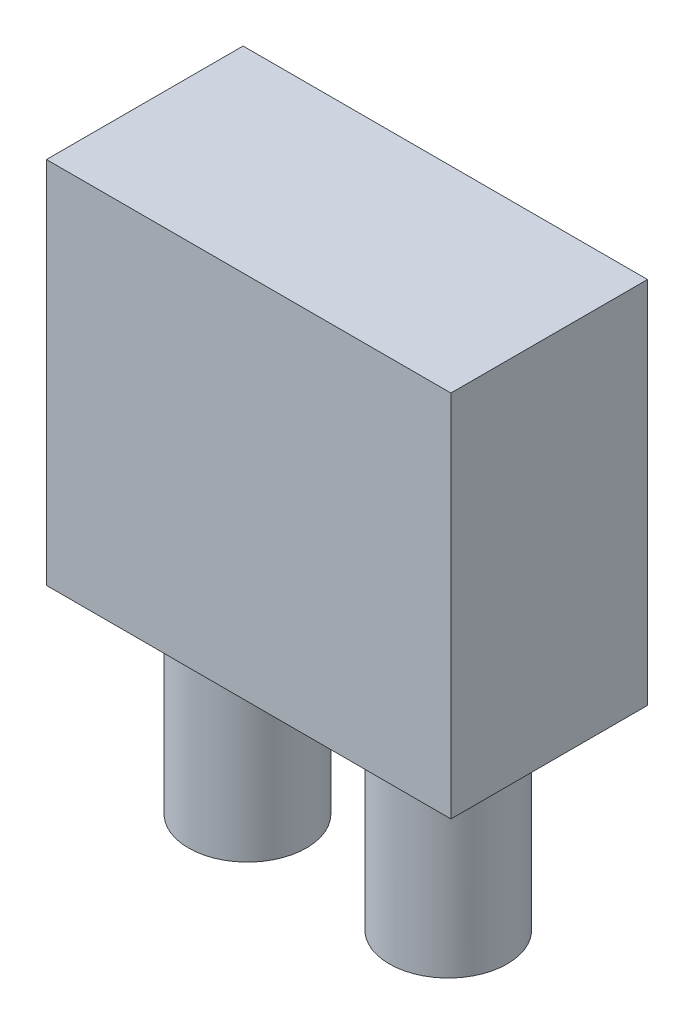
ISO-10303-21;
HEADER;
FILE_DESCRIPTION(('STEP AP214'),'2;1');
FILE_NAME('part.step','',(''),(''),'','','');
FILE_SCHEMA(('AUTOMOTIVE_DESIGN { 1 0 10303 214 1 1 1 1 }'));
ENDSEC;
DATA;
#1=APPLICATION_CONTEXT('core data for automotive mechanical design processes');
#2=APPLICATION_PROTOCOL_DEFINITION('international standard','automotive_design',2000,#1);
#3=PRODUCT_CONTEXT('',#1,'mechanical');
#4=PRODUCT('Part','Part','',(#3));
#5=PRODUCT_RELATED_PRODUCT_CATEGORY('part','',(#4));
#6=PRODUCT_DEFINITION_FORMATION('','',#4);
#7=PRODUCT_DEFINITION_CONTEXT('part definition',#1,'design');
#8=PRODUCT_DEFINITION('design','',#6,#7);
#9=PRODUCT_DEFINITION_SHAPE('','',#8);
#10=(LENGTH_UNIT() NAMED_UNIT(*) SI_UNIT(.MILLI.,.METRE.));
#11=(NAMED_UNIT(*) PLANE_ANGLE_UNIT() SI_UNIT($,.RADIAN.));
#12=(NAMED_UNIT(*) SI_UNIT($,.STERADIAN.) SOLID_ANGLE_UNIT());
#13=UNCERTAINTY_MEASURE_WITH_UNIT(LENGTH_MEASURE(1.E-05),#10,'distance_accuracy_value','');
#14=(GEOMETRIC_REPRESENTATION_CONTEXT(3) GLOBAL_UNCERTAINTY_ASSIGNED_CONTEXT((#13)) GLOBAL_UNIT_ASSIGNED_CONTEXT((#10,
#11,#12)) REPRESENTATION_CONTEXT('',''));
#15=CARTESIAN_POINT('',(0.,0.,0.));
#16=DIRECTION('',(0.,0.,1.));
#17=DIRECTION('',(1.,0.,0.));
#18=AXIS2_PLACEMENT_3D('',#15,#16,#17);
#19=CARTESIAN_POINT('',(-5.14248331253397,-4.69021342201887,5.));
#20=DIRECTION('',(1.,0.,0.));
#21=DIRECTION('',(0.,0.,-1.));
#22=AXIS2_PLACEMENT_3D('',#19,#20,#21);
#23=PLANE('',#22);
#24=DIRECTION('',(0.,-1.,0.));
#25=VECTOR('',#24,1.);
#26=CARTESIAN_POINT('',(-5.14248331253397,-4.69021342201887,0.));
#27=LINE('',#26,#25);
#28=CARTESIAN_POINT('',(-5.14248331253397,4.69021342201887,0.));
#29=VERTEX_POINT('',#28);
#30=CARTESIAN_POINT('',(-5.14248331253397,-4.69021342201887,0.));
#31=VERTEX_POINT('',#30);
#32=EDGE_CURVE('E100',#29,#31,#27,.T.);
#33=ORIENTED_EDGE('',*,*,#32,.T.);
#34=DIRECTION('',(0.,0.,-1.));
#35=VECTOR('',#34,1.);
#36=CARTESIAN_POINT('',(-5.14248331253397,-4.69021342201887,5.));
#37=LINE('',#36,#35);
#38=CARTESIAN_POINT('',(-5.14248331253397,-4.69021342201887,5.));
#39=VERTEX_POINT('',#38);
#40=EDGE_CURVE('E91',#39,#31,#37,.T.);
#41=ORIENTED_EDGE('',*,*,#40,.F.);
#42=DIRECTION('',(0.,-1.,0.));
#43=VECTOR('',#42,1.);
#44=CARTESIAN_POINT('',(-5.14248331253397,-4.69021342201887,5.));
#45=LINE('',#44,#43);
#46=CARTESIAN_POINT('',(-5.14248331253397,4.69021342201887,5.));
#47=VERTEX_POINT('',#46);
#48=EDGE_CURVE('E85',#47,#39,#45,.T.);
#49=ORIENTED_EDGE('',*,*,#48,.F.);
#50=DIRECTION('',(0.,0.,-1.));
#51=VECTOR('',#50,1.);
#52=CARTESIAN_POINT('',(-5.14248331253397,4.69021342201887,5.));
#53=LINE('',#52,#51);
#54=EDGE_CURVE('E96',#47,#29,#53,.T.);
#55=ORIENTED_EDGE('',*,*,#54,.T.);
#56=EDGE_LOOP('',(#33,#41,#49,#55));
#57=FACE_BOUND('',#56,.T.);
#58=ADVANCED_FACE('F33',(#57),#23,.F.);
#59=CARTESIAN_POINT('',(5.14248331253397,-4.69021342201887,5.));
#60=DIRECTION('',(0.,1.,0.));
#61=DIRECTION('',(0.,0.,1.));
#62=AXIS2_PLACEMENT_3D('',#59,#60,#61);
#63=PLANE('',#62);
#64=CARTESIAN_POINT('',(-2.55317636427646,-4.69021342201887,2.47807185459125));
#65=DIRECTION('',(0.,1.,0.));
#66=DIRECTION('',(0.,0.,1.));
#67=AXIS2_PLACEMENT_3D('',#64,#65,#66);
#68=CIRCLE('',#67,1.5);
#69=CARTESIAN_POINT('',(-2.55317636427646,-4.69021342201887,3.97807185459125));
#70=VERTEX_POINT('',#69);
#71=EDGE_CURVE('E11',#70,#70,#68,.F.);
#72=ORIENTED_EDGE('',*,*,#71,.F.);
#73=EDGE_LOOP('',(#72));
#74=FACE_BOUND('',#73,.T.);
#75=CARTESIAN_POINT('',(2.55317636427646,-4.69021342201887,2.47807185459125));
#76=DIRECTION('',(0.,1.,0.));
#77=DIRECTION('',(0.,0.,1.));
#78=AXIS2_PLACEMENT_3D('',#75,#76,#77);
#79=CIRCLE('',#78,1.5);
#80=CARTESIAN_POINT('',(2.55317636427646,-4.69021342201887,3.97807185459125));
#81=VERTEX_POINT('',#80);
#82=EDGE_CURVE('E41',#81,#81,#79,.F.);
#83=ORIENTED_EDGE('',*,*,#82,.F.);
#84=EDGE_LOOP('',(#83));
#85=FACE_BOUND('',#84,.T.);
#86=DIRECTION('',(1.,0.,0.));
#87=VECTOR('',#86,1.);
#88=CARTESIAN_POINT('',(5.14248331253397,-4.69021342201887,0.));
#89=LINE('',#88,#87);
#90=CARTESIAN_POINT('',(5.14248331253397,-4.69021342201887,0.));
#91=VERTEX_POINT('',#90);
#92=EDGE_CURVE('E90',#31,#91,#89,.T.);
#93=ORIENTED_EDGE('',*,*,#92,.T.);
#94=DIRECTION('',(0.,0.,-1.));
#95=VECTOR('',#94,1.);
#96=CARTESIAN_POINT('',(5.14248331253397,-4.69021342201887,5.));
#97=LINE('',#96,#95);
#98=CARTESIAN_POINT('',(5.14248331253397,-4.69021342201887,5.));
#99=VERTEX_POINT('',#98);
#100=EDGE_CURVE('E88',#99,#91,#97,.T.);
#101=ORIENTED_EDGE('',*,*,#100,.F.);
#102=DIRECTION('',(1.,0.,0.));
#103=VECTOR('',#102,1.);
#104=CARTESIAN_POINT('',(5.14248331253397,-4.69021342201887,5.));
#105=LINE('',#104,#103);
#106=EDGE_CURVE('E80',#39,#99,#105,.T.);
#107=ORIENTED_EDGE('',*,*,#106,.F.);
#108=ORIENTED_EDGE('',*,*,#40,.T.);
#109=EDGE_LOOP('',(#93,#101,#107,#108));
#110=FACE_BOUND('',#109,.T.);
#111=ADVANCED_FACE('F89',(#74,#85,#110),#63,.F.);
#112=CARTESIAN_POINT('',(5.14248331253397,-4.69021342201887,5.));
#113=DIRECTION('',(-1.,0.,0.));
#114=DIRECTION('',(0.,0.,1.));
#115=AXIS2_PLACEMENT_3D('',#112,#113,#114);
#116=PLANE('',#115);
#117=DIRECTION('',(0.,1.,0.));
#118=VECTOR('',#117,1.);
#119=CARTESIAN_POINT('',(5.14248331253397,-4.69021342201887,0.));
#120=LINE('',#119,#118);
#121=CARTESIAN_POINT('',(5.14248331253397,4.69021342201887,0.));
#122=VERTEX_POINT('',#121);
#123=EDGE_CURVE('E66',#91,#122,#120,.T.);
#124=ORIENTED_EDGE('',*,*,#123,.T.);
#125=DIRECTION('',(0.,0.,-1.));
#126=VECTOR('',#125,1.);
#127=CARTESIAN_POINT('',(5.14248331253397,4.69021342201887,5.));
#128=LINE('',#127,#126);
#129=CARTESIAN_POINT('',(5.14248331253397,4.69021342201887,5.));
#130=VERTEX_POINT('',#129);
#131=EDGE_CURVE('E92',#130,#122,#128,.T.);
#132=ORIENTED_EDGE('',*,*,#131,.F.);
#133=DIRECTION('',(0.,1.,0.));
#134=VECTOR('',#133,1.);
#135=CARTESIAN_POINT('',(5.14248331253397,-4.69021342201887,5.));
#136=LINE('',#135,#134);
#137=EDGE_CURVE('E83',#99,#130,#136,.T.);
#138=ORIENTED_EDGE('',*,*,#137,.F.);
#139=ORIENTED_EDGE('',*,*,#100,.T.);
#140=EDGE_LOOP('',(#124,#132,#138,#139));
#141=FACE_BOUND('',#140,.T.);
#142=ADVANCED_FACE('F94',(#141),#116,.F.);
#143=CARTESIAN_POINT('',(5.14248331253397,4.69021342201887,5.));
#144=DIRECTION('',(0.,-1.,0.));
#145=DIRECTION('',(0.,0.,-1.));
#146=AXIS2_PLACEMENT_3D('',#143,#144,#145);
#147=PLANE('',#146);
#148=DIRECTION('',(-1.,0.,0.));
#149=VECTOR('',#148,1.);
#150=CARTESIAN_POINT('',(5.14248331253397,4.69021342201887,0.));
#151=LINE('',#150,#149);
#152=EDGE_CURVE('E72',#122,#29,#151,.T.);
#153=ORIENTED_EDGE('',*,*,#152,.T.);
#154=ORIENTED_EDGE('',*,*,#54,.F.);
#155=DIRECTION('',(-1.,0.,0.));
#156=VECTOR('',#155,1.);
#157=CARTESIAN_POINT('',(5.14248331253397,4.69021342201887,5.));
#158=LINE('',#157,#156);
#159=EDGE_CURVE('E49',#130,#47,#158,.T.);
#160=ORIENTED_EDGE('',*,*,#159,.F.);
#161=ORIENTED_EDGE('',*,*,#131,.T.);
#162=EDGE_LOOP('',(#153,#154,#160,#161));
#163=FACE_BOUND('',#162,.T.);
#164=ADVANCED_FACE('F120',(#163),#147,.F.);
#165=CARTESIAN_POINT('',(0.,0.,5.));
#166=DIRECTION('',(0.,0.,1.));
#167=DIRECTION('',(1.,0.,0.));
#168=AXIS2_PLACEMENT_3D('',#165,#166,#167);
#169=PLANE('',#168);
#170=ORIENTED_EDGE('',*,*,#48,.T.);
#171=ORIENTED_EDGE('',*,*,#106,.T.);
#172=ORIENTED_EDGE('',*,*,#137,.T.);
#173=ORIENTED_EDGE('',*,*,#159,.T.);
#174=EDGE_LOOP('',(#170,#171,#172,#173));
#175=FACE_BOUND('',#174,.T.);
#176=ADVANCED_FACE('F81',(#175),#169,.T.);
#177=CARTESIAN_POINT('',(0.,0.,0.));
#178=DIRECTION('',(0.,0.,1.));
#179=DIRECTION('',(1.,0.,0.));
#180=AXIS2_PLACEMENT_3D('',#177,#178,#179);
#181=PLANE('',#180);
#182=ORIENTED_EDGE('',*,*,#32,.F.);
#183=ORIENTED_EDGE('',*,*,#152,.F.);
#184=ORIENTED_EDGE('',*,*,#123,.F.);
#185=ORIENTED_EDGE('',*,*,#92,.F.);
#186=EDGE_LOOP('',(#182,#183,#184,#185));
#187=FACE_BOUND('',#186,.T.);
#188=ADVANCED_FACE('F127',(#187),#181,.F.);
#189=CARTESIAN_POINT('',(2.55317636427646,-9.69021342201887,2.47807185459125));
#190=DIRECTION('',(0.,1.,0.));
#191=DIRECTION('',(0.,0.,1.));
#192=AXIS2_PLACEMENT_3D('',#189,#190,#191);
#193=CYLINDRICAL_SURFACE('',#192,1.5);
#194=CARTESIAN_POINT('',(2.55317636427646,-9.69021342201887,2.47807185459125));
#195=DIRECTION('',(0.,-1.,0.));
#196=DIRECTION('',(0.,0.,-1.));
#197=AXIS2_PLACEMENT_3D('',#194,#195,#196);
#198=CIRCLE('',#197,1.5);
#199=CARTESIAN_POINT('',(2.55317636427646,-9.69021342201887,0.97807185459125));
#200=VERTEX_POINT('',#199);
#201=EDGE_CURVE('E103',#200,#200,#198,.T.);
#202=ORIENTED_EDGE('',*,*,#201,.F.);
#203=EDGE_LOOP('',(#202));
#204=FACE_BOUND('',#203,.T.);
#205=ORIENTED_EDGE('',*,*,#82,.T.);
#206=EDGE_LOOP('',(#205));
#207=FACE_BOUND('',#206,.T.);
#208=ADVANCED_FACE('F112',(#204,#207),#193,.T.);
#209=CARTESIAN_POINT('',(2.55317636427646,-9.69021342201887,2.47807185459125));
#210=DIRECTION('',(0.,-1.,0.));
#211=DIRECTION('',(0.,0.,-1.));
#212=AXIS2_PLACEMENT_3D('',#209,#210,#211);
#213=PLANE('',#212);
#214=ORIENTED_EDGE('',*,*,#201,.T.);
#215=EDGE_LOOP('',(#214));
#216=FACE_BOUND('',#215,.T.);
#217=ADVANCED_FACE('F135',(#216),#213,.T.);
#218=CARTESIAN_POINT('',(-2.55317636427646,-9.69021342201887,2.47807185459125));
#219=DIRECTION('',(0.,1.,0.));
#220=DIRECTION('',(0.,0.,1.));
#221=AXIS2_PLACEMENT_3D('',#218,#219,#220);
#222=CYLINDRICAL_SURFACE('',#221,1.5);
#223=CARTESIAN_POINT('',(-2.55317636427646,-9.69021342201887,2.47807185459125));
#224=DIRECTION('',(0.,-1.,0.));
#225=DIRECTION('',(0.,0.,1.));
#226=AXIS2_PLACEMENT_3D('',#223,#224,#225);
#227=CIRCLE('',#226,1.5);
#228=CARTESIAN_POINT('',(-2.55317636427646,-9.69021342201887,3.97807185459125));
#229=VERTEX_POINT('',#228);
#230=EDGE_CURVE('E151',#229,#229,#227,.T.);
#231=ORIENTED_EDGE('',*,*,#230,.F.);
#232=EDGE_LOOP('',(#231));
#233=FACE_BOUND('',#232,.T.);
#234=ORIENTED_EDGE('',*,*,#71,.T.);
#235=EDGE_LOOP('',(#234));
#236=FACE_BOUND('',#235,.T.);
#237=ADVANCED_FACE('F139',(#233,#236),#222,.T.);
#238=CARTESIAN_POINT('',(-2.55317636427646,-9.69021342201887,2.47807185459125));
#239=DIRECTION('',(0.,1.,0.));
#240=DIRECTION('',(0.,0.,1.));
#241=AXIS2_PLACEMENT_3D('',#238,#239,#240);
#242=PLANE('',#241);
#243=ORIENTED_EDGE('',*,*,#230,.T.);
#244=EDGE_LOOP('',(#243));
#245=FACE_BOUND('',#244,.T.);
#246=ADVANCED_FACE('F143',(#245),#242,.F.);
#247=CLOSED_SHELL('',(#58,#111,#142,#164,#176,#188,#208,#217,#237,#246));
#248=MANIFOLD_SOLID_BREP('B2',#247);
#249=ADVANCED_BREP_SHAPE_REPRESENTATION('',(#18,#248),#14);
#250=SHAPE_DEFINITION_REPRESENTATION(#9,#249);
ENDSEC;
END-ISO-10303-21;
